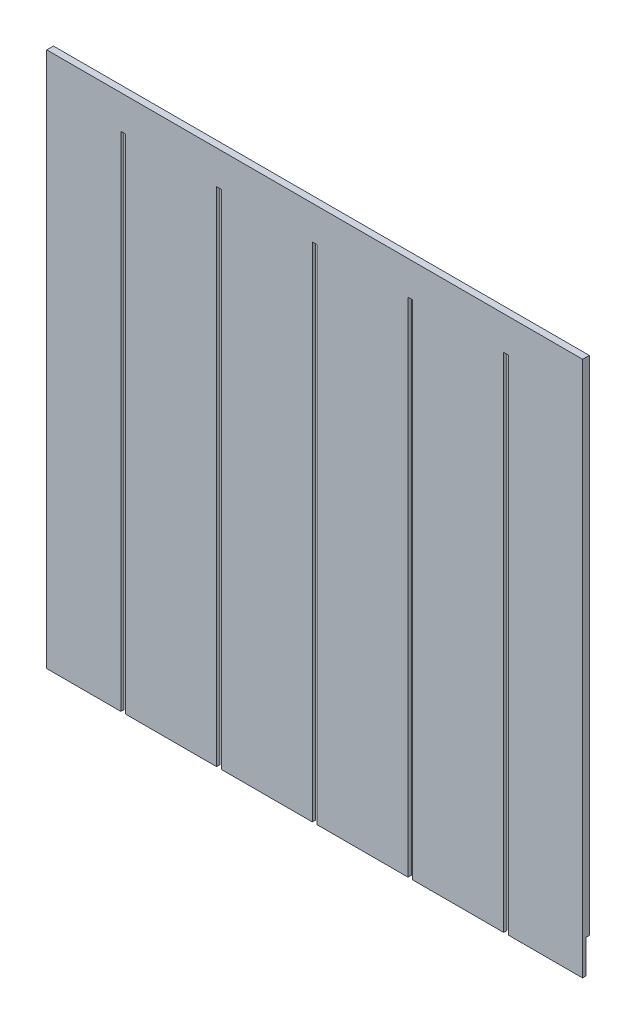
ISO-10303-21;
HEADER;
FILE_DESCRIPTION(('STEP AP214'),'2;1');
FILE_NAME('part.step','',(''),(''),'','','');
FILE_SCHEMA(('AUTOMOTIVE_DESIGN { 1 0 10303 214 1 1 1 1 }'));
ENDSEC;
DATA;
#1=APPLICATION_CONTEXT('core data for automotive mechanical design processes');
#2=APPLICATION_PROTOCOL_DEFINITION('international standard','automotive_design',2000,#1);
#3=PRODUCT_CONTEXT('',#1,'mechanical');
#4=PRODUCT('Part','Part','',(#3));
#5=PRODUCT_RELATED_PRODUCT_CATEGORY('part','',(#4));
#6=PRODUCT_DEFINITION_FORMATION('','',#4);
#7=PRODUCT_DEFINITION_CONTEXT('part definition',#1,'design');
#8=PRODUCT_DEFINITION('design','',#6,#7);
#9=PRODUCT_DEFINITION_SHAPE('','',#8);
#10=(LENGTH_UNIT() NAMED_UNIT(*) SI_UNIT(.MILLI.,.METRE.));
#11=(NAMED_UNIT(*) PLANE_ANGLE_UNIT() SI_UNIT($,.RADIAN.));
#12=(NAMED_UNIT(*) SI_UNIT($,.STERADIAN.) SOLID_ANGLE_UNIT());
#13=UNCERTAINTY_MEASURE_WITH_UNIT(LENGTH_MEASURE(1.E-05),#10,'distance_accuracy_value','');
#14=(GEOMETRIC_REPRESENTATION_CONTEXT(3) GLOBAL_UNCERTAINTY_ASSIGNED_CONTEXT((#13)) GLOBAL_UNIT_ASSIGNED_CONTEXT((#10,
#11,#12)) REPRESENTATION_CONTEXT('',''));
#15=CARTESIAN_POINT('',(0.,0.,0.));
#16=DIRECTION('',(0.,0.,1.));
#17=DIRECTION('',(1.,0.,0.));
#18=AXIS2_PLACEMENT_3D('',#15,#16,#17);
#19=CARTESIAN_POINT('',(0.,0.,0.));
#20=DIRECTION('',(0.,0.,1.));
#21=DIRECTION('',(1.,0.,0.));
#22=AXIS2_PLACEMENT_3D('',#19,#20,#21);
#23=PLANE('',#22);
#24=DIRECTION('',(-1.,0.,0.));
#25=VECTOR('',#24,1.);
#26=CARTESIAN_POINT('',(70.,70.,0.));
#27=LINE('',#26,#25);
#28=CARTESIAN_POINT('',(56.46,70.,0.));
#29=VERTEX_POINT('',#28);
#30=CARTESIAN_POINT('',(29.28,70.,0.));
#31=VERTEX_POINT('',#30);
#32=EDGE_CURVE('E11',#29,#31,#27,.T.);
#33=ORIENTED_EDGE('',*,*,#32,.F.);
#34=DIRECTION('',(0.,-1.,0.));
#35=VECTOR('',#34,1.);
#36=CARTESIAN_POINT('',(56.46,0.,0.));
#37=LINE('',#36,#35);
#38=CARTESIAN_POINT('',(56.46,-80.,0.));
#39=VERTEX_POINT('',#38);
#40=EDGE_CURVE('E298',#29,#39,#37,.T.);
#41=ORIENTED_EDGE('',*,*,#40,.T.);
#42=DIRECTION('',(-1.,0.,0.));
#43=VECTOR('',#42,1.);
#44=CARTESIAN_POINT('',(0.,-80.,0.));
#45=LINE('',#44,#43);
#46=CARTESIAN_POINT('',(29.28,-80.,0.));
#47=VERTEX_POINT('',#46);
#48=EDGE_CURVE('E311',#39,#47,#45,.T.);
#49=ORIENTED_EDGE('',*,*,#48,.T.);
#50=DIRECTION('',(0.,1.,0.));
#51=VECTOR('',#50,1.);
#52=CARTESIAN_POINT('',(29.28,0.,0.));
#53=LINE('',#52,#51);
#54=EDGE_CURVE('E412',#47,#31,#53,.T.);
#55=ORIENTED_EDGE('',*,*,#54,.T.);
#56=EDGE_LOOP('',(#33,#41,#49,#55));
#57=FACE_BOUND('',#56,.T.);
#58=ADVANCED_FACE('F38',(#57),#23,.F.);
#59=CARTESIAN_POINT('',(27.88,70.,0.));
#60=VERTEX_POINT('',#59);
#61=CARTESIAN_POINT('',(0.699999999999999,70.,0.));
#62=VERTEX_POINT('',#61);
#63=EDGE_CURVE('E47',#60,#62,#27,.T.);
#64=ORIENTED_EDGE('',*,*,#63,.F.);
#65=DIRECTION('',(0.,-1.,0.));
#66=VECTOR('',#65,1.);
#67=CARTESIAN_POINT('',(27.88,0.,0.));
#68=LINE('',#67,#66);
#69=CARTESIAN_POINT('',(27.88,-80.,0.));
#70=VERTEX_POINT('',#69);
#71=EDGE_CURVE('E409',#60,#70,#68,.T.);
#72=ORIENTED_EDGE('',*,*,#71,.T.);
#73=DIRECTION('',(1.,0.,0.));
#74=VECTOR('',#73,1.);
#75=CARTESIAN_POINT('',(0.,-80.,0.));
#76=LINE('',#75,#74);
#77=CARTESIAN_POINT('',(0.699999999999985,-80.,0.));
#78=VERTEX_POINT('',#77);
#79=EDGE_CURVE('E406',#78,#70,#76,.T.);
#80=ORIENTED_EDGE('',*,*,#79,.F.);
#81=DIRECTION('',(0.,1.,0.));
#82=VECTOR('',#81,1.);
#83=CARTESIAN_POINT('',(0.699999999999993,0.,0.));
#84=LINE('',#83,#82);
#85=EDGE_CURVE('E403',#78,#62,#84,.T.);
#86=ORIENTED_EDGE('',*,*,#85,.T.);
#87=EDGE_LOOP('',(#64,#72,#80,#86));
#88=FACE_BOUND('',#87,.T.);
#89=ADVANCED_FACE('F617',(#88),#23,.F.);
#90=CARTESIAN_POINT('',(-0.699999999999999,70.,0.));
#91=VERTEX_POINT('',#90);
#92=CARTESIAN_POINT('',(-27.88,70.,0.));
#93=VERTEX_POINT('',#92);
#94=EDGE_CURVE('E477',#91,#93,#27,.T.);
#95=ORIENTED_EDGE('',*,*,#94,.F.);
#96=DIRECTION('',(0.,-1.,0.));
#97=VECTOR('',#96,1.);
#98=CARTESIAN_POINT('',(-0.699999999999993,0.,0.));
#99=LINE('',#98,#97);
#100=CARTESIAN_POINT('',(-0.699999999999985,-80.,0.));
#101=VERTEX_POINT('',#100);
#102=EDGE_CURVE('E400',#91,#101,#99,.T.);
#103=ORIENTED_EDGE('',*,*,#102,.T.);
#104=DIRECTION('',(1.,0.,0.));
#105=VECTOR('',#104,1.);
#106=CARTESIAN_POINT('',(0.,-80.,0.));
#107=LINE('',#106,#105);
#108=CARTESIAN_POINT('',(-27.88,-80.,0.));
#109=VERTEX_POINT('',#108);
#110=EDGE_CURVE('E397',#109,#101,#107,.T.);
#111=ORIENTED_EDGE('',*,*,#110,.F.);
#112=DIRECTION('',(0.,1.,0.));
#113=VECTOR('',#112,1.);
#114=CARTESIAN_POINT('',(-27.88,0.,0.));
#115=LINE('',#114,#113);
#116=EDGE_CURVE('E394',#109,#93,#115,.T.);
#117=ORIENTED_EDGE('',*,*,#116,.T.);
#118=EDGE_LOOP('',(#95,#103,#111,#117));
#119=FACE_BOUND('',#118,.T.);
#120=ADVANCED_FACE('F623',(#119),#23,.F.);
#121=CARTESIAN_POINT('',(-29.28,70.,0.));
#122=VERTEX_POINT('',#121);
#123=CARTESIAN_POINT('',(-56.46,70.,0.));
#124=VERTEX_POINT('',#123);
#125=EDGE_CURVE('E473',#122,#124,#27,.T.);
#126=ORIENTED_EDGE('',*,*,#125,.F.);
#127=DIRECTION('',(0.,-1.,0.));
#128=VECTOR('',#127,1.);
#129=CARTESIAN_POINT('',(-29.28,0.,0.));
#130=LINE('',#129,#128);
#131=CARTESIAN_POINT('',(-29.28,-80.,0.));
#132=VERTEX_POINT('',#131);
#133=EDGE_CURVE('E391',#122,#132,#130,.T.);
#134=ORIENTED_EDGE('',*,*,#133,.T.);
#135=DIRECTION('',(1.,0.,0.));
#136=VECTOR('',#135,1.);
#137=CARTESIAN_POINT('',(0.,-80.,0.));
#138=LINE('',#137,#136);
#139=CARTESIAN_POINT('',(-56.46,-80.,0.));
#140=VERTEX_POINT('',#139);
#141=EDGE_CURVE('E388',#140,#132,#138,.T.);
#142=ORIENTED_EDGE('',*,*,#141,.F.);
#143=DIRECTION('',(0.,1.,0.));
#144=VECTOR('',#143,1.);
#145=CARTESIAN_POINT('',(-56.46,0.,0.));
#146=LINE('',#145,#144);
#147=EDGE_CURVE('E385',#140,#124,#146,.T.);
#148=ORIENTED_EDGE('',*,*,#147,.T.);
#149=EDGE_LOOP('',(#126,#134,#142,#148));
#150=FACE_BOUND('',#149,.T.);
#151=ADVANCED_FACE('F632',(#150),#23,.F.);
#152=DIRECTION('',(-1.,0.,0.));
#153=VECTOR('',#152,1.);
#154=CARTESIAN_POINT('',(-77.5,70.,0.));
#155=LINE('',#154,#153);
#156=CARTESIAN_POINT('',(-77.5,70.,0.));
#157=VERTEX_POINT('',#156);
#158=CARTESIAN_POINT('',(-80.,70.,0.));
#159=VERTEX_POINT('',#158);
#160=EDGE_CURVE('E56',#157,#159,#155,.T.);
#161=ORIENTED_EDGE('',*,*,#160,.F.);
#162=DIRECTION('',(0.,-1.,0.));
#163=VECTOR('',#162,1.);
#164=CARTESIAN_POINT('',(-77.5,70.,0.));
#165=LINE('',#164,#163);
#166=CARTESIAN_POINT('',(-77.5,72.5,0.));
#167=VERTEX_POINT('',#166);
#168=EDGE_CURVE('E60',#167,#157,#165,.T.);
#169=ORIENTED_EDGE('',*,*,#168,.F.);
#170=DIRECTION('',(-1.,0.,0.));
#171=VECTOR('',#170,1.);
#172=CARTESIAN_POINT('',(-72.5,72.5,0.));
#173=LINE('',#172,#171);
#174=CARTESIAN_POINT('',(-72.5,72.5,0.));
#175=VERTEX_POINT('',#174);
#176=EDGE_CURVE('E485',#175,#167,#173,.T.);
#177=ORIENTED_EDGE('',*,*,#176,.F.);
#178=DIRECTION('',(0.,1.,0.));
#179=VECTOR('',#178,1.);
#180=CARTESIAN_POINT('',(-72.5,70.,0.));
#181=LINE('',#180,#179);
#182=CARTESIAN_POINT('',(-72.5,70.,0.));
#183=VERTEX_POINT('',#182);
#184=EDGE_CURVE('E481',#183,#175,#181,.T.);
#185=ORIENTED_EDGE('',*,*,#184,.F.);
#186=CARTESIAN_POINT('',(-57.86,70.,0.));
#187=VERTEX_POINT('',#186);
#188=EDGE_CURVE('E468',#187,#183,#27,.T.);
#189=ORIENTED_EDGE('',*,*,#188,.F.);
#190=DIRECTION('',(0.,-1.,0.));
#191=VECTOR('',#190,1.);
#192=CARTESIAN_POINT('',(-57.86,0.,0.));
#193=LINE('',#192,#191);
#194=CARTESIAN_POINT('',(-57.86,-80.,0.));
#195=VERTEX_POINT('',#194);
#196=EDGE_CURVE('E382',#187,#195,#193,.T.);
#197=ORIENTED_EDGE('',*,*,#196,.T.);
#198=DIRECTION('',(1.,0.,0.));
#199=VECTOR('',#198,1.);
#200=CARTESIAN_POINT('',(0.,-80.,0.));
#201=LINE('',#200,#199);
#202=CARTESIAN_POINT('',(-80.,-80.,0.));
#203=VERTEX_POINT('',#202);
#204=EDGE_CURVE('E379',#203,#195,#201,.T.);
#205=ORIENTED_EDGE('',*,*,#204,.F.);
#206=DIRECTION('',(0.,1.,0.));
#207=VECTOR('',#206,1.);
#208=CARTESIAN_POINT('',(-80.,0.,0.));
#209=LINE('',#208,#207);
#210=EDGE_CURVE('E377',#203,#159,#209,.T.);
#211=ORIENTED_EDGE('',*,*,#210,.T.);
#212=EDGE_LOOP('',(#161,#169,#177,#185,#189,#197,#205,#211));
#213=FACE_BOUND('',#212,.T.);
#214=ADVANCED_FACE('F628',(#213),#23,.F.);
#215=CARTESIAN_POINT('',(70.,70.,0.));
#216=VERTEX_POINT('',#215);
#217=CARTESIAN_POINT('',(57.86,70.,0.));
#218=VERTEX_POINT('',#217);
#219=EDGE_CURVE('E49',#216,#218,#27,.T.);
#220=ORIENTED_EDGE('',*,*,#219,.F.);
#221=DIRECTION('',(0.,1.,0.));
#222=VECTOR('',#221,1.);
#223=CARTESIAN_POINT('',(70.,-70.,0.));
#224=LINE('',#223,#222);
#225=CARTESIAN_POINT('',(70.,-70.,0.));
#226=VERTEX_POINT('',#225);
#227=EDGE_CURVE('E482',#226,#216,#224,.T.);
#228=ORIENTED_EDGE('',*,*,#227,.F.);
#229=DIRECTION('',(-1.,0.,0.));
#230=VECTOR('',#229,1.);
#231=CARTESIAN_POINT('',(72.5,-70.,0.));
#232=LINE('',#231,#230);
#233=CARTESIAN_POINT('',(72.5,-70.,0.));
#234=VERTEX_POINT('',#233);
#235=EDGE_CURVE('E487',#234,#226,#232,.T.);
#236=ORIENTED_EDGE('',*,*,#235,.F.);
#237=DIRECTION('',(0.,-1.,0.));
#238=VECTOR('',#237,1.);
#239=CARTESIAN_POINT('',(72.5,-70.,0.));
#240=LINE('',#239,#238);
#241=CARTESIAN_POINT('',(72.5,-67.5,0.));
#242=VERTEX_POINT('',#241);
#243=EDGE_CURVE('E492',#242,#234,#240,.T.);
#244=ORIENTED_EDGE('',*,*,#243,.F.);
#245=DIRECTION('',(-1.,0.,0.));
#246=VECTOR('',#245,1.);
#247=CARTESIAN_POINT('',(77.5,-67.5,0.));
#248=LINE('',#247,#246);
#249=CARTESIAN_POINT('',(77.5,-67.5,0.));
#250=VERTEX_POINT('',#249);
#251=EDGE_CURVE('E497',#250,#242,#248,.T.);
#252=ORIENTED_EDGE('',*,*,#251,.F.);
#253=DIRECTION('',(0.,1.,0.));
#254=VECTOR('',#253,1.);
#255=CARTESIAN_POINT('',(77.5,-70.,0.));
#256=LINE('',#255,#254);
#257=CARTESIAN_POINT('',(77.5,-70.,0.));
#258=VERTEX_POINT('',#257);
#259=EDGE_CURVE('E500',#258,#250,#256,.T.);
#260=ORIENTED_EDGE('',*,*,#259,.F.);
#261=DIRECTION('',(-1.,0.,0.));
#262=VECTOR('',#261,1.);
#263=CARTESIAN_POINT('',(80.,-70.,0.));
#264=LINE('',#263,#262);
#265=CARTESIAN_POINT('',(80.,-70.,0.));
#266=VERTEX_POINT('',#265);
#267=EDGE_CURVE('E503',#266,#258,#264,.T.);
#268=ORIENTED_EDGE('',*,*,#267,.F.);
#269=DIRECTION('',(0.,1.,0.));
#270=VECTOR('',#269,1.);
#271=CARTESIAN_POINT('',(80.,0.,0.));
#272=LINE('',#271,#270);
#273=CARTESIAN_POINT('',(80.,-80.,0.));
#274=VERTEX_POINT('',#273);
#275=EDGE_CURVE('E297',#274,#266,#272,.T.);
#276=ORIENTED_EDGE('',*,*,#275,.F.);
#277=DIRECTION('',(-1.,0.,0.));
#278=VECTOR('',#277,1.);
#279=CARTESIAN_POINT('',(0.,-80.0000000000001,0.));
#280=LINE('',#279,#278);
#281=CARTESIAN_POINT('',(57.86,-80.,0.));
#282=VERTEX_POINT('',#281);
#283=EDGE_CURVE('E373',#274,#282,#280,.T.);
#284=ORIENTED_EDGE('',*,*,#283,.T.);
#285=DIRECTION('',(0.,1.,0.));
#286=VECTOR('',#285,1.);
#287=CARTESIAN_POINT('',(57.86,0.,0.));
#288=LINE('',#287,#286);
#289=EDGE_CURVE('E301',#282,#218,#288,.T.);
#290=ORIENTED_EDGE('',*,*,#289,.T.);
#291=EDGE_LOOP('',(#220,#228,#236,#244,#252,#260,#268,#276,#284,#290));
#292=FACE_BOUND('',#291,.T.);
#293=ADVANCED_FACE('F600',(#292),#23,.F.);
#294=CARTESIAN_POINT('',(56.46,0.,1.));
#295=DIRECTION('',(1.,0.,0.));
#296=DIRECTION('',(0.,1.,0.));
#297=AXIS2_PLACEMENT_3D('',#294,#295,#296);
#298=PLANE('',#297);
#299=ORIENTED_EDGE('',*,*,#40,.F.);
#300=DIRECTION('',(0.,0.,-1.));
#301=VECTOR('',#300,1.);
#302=CARTESIAN_POINT('',(56.46,70.,1.));
#303=LINE('',#302,#301);
#304=CARTESIAN_POINT('',(56.46,70.,1.));
#305=VERTEX_POINT('',#304);
#306=EDGE_CURVE('E42',#305,#29,#303,.T.);
#307=ORIENTED_EDGE('',*,*,#306,.F.);
#308=DIRECTION('',(0.,-1.,0.));
#309=VECTOR('',#308,1.);
#310=CARTESIAN_POINT('',(56.46,0.,1.));
#311=LINE('',#310,#309);
#312=CARTESIAN_POINT('',(56.46,-80.,1.));
#313=VERTEX_POINT('',#312);
#314=EDGE_CURVE('E307',#305,#313,#311,.T.);
#315=ORIENTED_EDGE('',*,*,#314,.T.);
#316=DIRECTION('',(0.,0.,-1.));
#317=VECTOR('',#316,1.);
#318=CARTESIAN_POINT('',(56.46,-80.,1.));
#319=LINE('',#318,#317);
#320=EDGE_CURVE('E369',#313,#39,#319,.T.);
#321=ORIENTED_EDGE('',*,*,#320,.T.);
#322=EDGE_LOOP('',(#299,#307,#315,#321));
#323=FACE_BOUND('',#322,.T.);
#324=ADVANCED_FACE('F40',(#323),#298,.T.);
#325=CARTESIAN_POINT('',(57.86,0.,1.));
#326=DIRECTION('',(-1.,0.,0.));
#327=DIRECTION('',(0.,-1.,0.));
#328=AXIS2_PLACEMENT_3D('',#325,#326,#327);
#329=PLANE('',#328);
#330=ORIENTED_EDGE('',*,*,#289,.F.);
#331=DIRECTION('',(0.,0.,-1.));
#332=VECTOR('',#331,1.);
#333=CARTESIAN_POINT('',(57.86,-80.,1.));
#334=LINE('',#333,#332);
#335=CARTESIAN_POINT('',(57.86,-80.,1.));
#336=VERTEX_POINT('',#335);
#337=EDGE_CURVE('E462',#336,#282,#334,.T.);
#338=ORIENTED_EDGE('',*,*,#337,.F.);
#339=DIRECTION('',(0.,1.,0.));
#340=VECTOR('',#339,1.);
#341=CARTESIAN_POINT('',(57.86,0.,1.));
#342=LINE('',#341,#340);
#343=CARTESIAN_POINT('',(57.86,70.,1.));
#344=VERTEX_POINT('',#343);
#345=EDGE_CURVE('E313',#336,#344,#342,.T.);
#346=ORIENTED_EDGE('',*,*,#345,.T.);
#347=DIRECTION('',(0.,0.,-1.));
#348=VECTOR('',#347,1.);
#349=CARTESIAN_POINT('',(57.86,70.,1.));
#350=LINE('',#349,#348);
#351=EDGE_CURVE('E463',#344,#218,#350,.T.);
#352=ORIENTED_EDGE('',*,*,#351,.T.);
#353=EDGE_LOOP('',(#330,#338,#346,#352));
#354=FACE_BOUND('',#353,.T.);
#355=ADVANCED_FACE('F602',(#354),#329,.T.);
#356=CARTESIAN_POINT('',(0.,-80.0000000000001,1.));
#357=DIRECTION('',(0.,-1.,0.));
#358=DIRECTION('',(1.,0.,0.));
#359=AXIS2_PLACEMENT_3D('',#356,#357,#358);
#360=PLANE('',#359);
#361=ORIENTED_EDGE('',*,*,#283,.F.);
#362=DIRECTION('',(0.,0.,-1.));
#363=VECTOR('',#362,1.);
#364=CARTESIAN_POINT('',(80.,-80.,1.));
#365=LINE('',#364,#363);
#366=CARTESIAN_POINT('',(80.,-80.,1.));
#367=VERTEX_POINT('',#366);
#368=EDGE_CURVE('E460',#367,#274,#365,.T.);
#369=ORIENTED_EDGE('',*,*,#368,.F.);
#370=DIRECTION('',(-1.,0.,0.));
#371=VECTOR('',#370,1.);
#372=CARTESIAN_POINT('',(0.,-80.0000000000001,1.));
#373=LINE('',#372,#371);
#374=EDGE_CURVE('E316',#367,#336,#373,.T.);
#375=ORIENTED_EDGE('',*,*,#374,.T.);
#376=ORIENTED_EDGE('',*,*,#337,.T.);
#377=EDGE_LOOP('',(#361,#369,#375,#376));
#378=FACE_BOUND('',#377,.T.);
#379=ADVANCED_FACE('F601',(#378),#360,.T.);
#380=CARTESIAN_POINT('',(80.,0.,1.));
#381=DIRECTION('',(-1.,0.,0.));
#382=DIRECTION('',(0.,0.,1.));
#383=AXIS2_PLACEMENT_3D('',#380,#381,#382);
#384=PLANE('',#383);
#385=ORIENTED_EDGE('',*,*,#275,.T.);
#386=DIRECTION('',(0.,0.,1.));
#387=VECTOR('',#386,1.);
#388=CARTESIAN_POINT('',(80.,-70.,-1.));
#389=LINE('',#388,#387);
#390=CARTESIAN_POINT('',(80.,-70.,-1.));
#391=VERTEX_POINT('',#390);
#392=EDGE_CURVE('E277',#391,#266,#389,.T.);
#393=ORIENTED_EDGE('',*,*,#392,.F.);
#394=DIRECTION('',(0.,-1.,0.));
#395=VECTOR('',#394,1.);
#396=CARTESIAN_POINT('',(80.,80.,-1.));
#397=LINE('',#396,#395);
#398=CARTESIAN_POINT('',(80.,80.,-1.));
#399=VERTEX_POINT('',#398);
#400=EDGE_CURVE('E283',#399,#391,#397,.T.);
#401=ORIENTED_EDGE('',*,*,#400,.F.);
#402=DIRECTION('',(0.,0.,-1.));
#403=VECTOR('',#402,1.);
#404=CARTESIAN_POINT('',(80.,80.,1.));
#405=LINE('',#404,#403);
#406=CARTESIAN_POINT('',(80.,80.,1.));
#407=VERTEX_POINT('',#406);
#408=EDGE_CURVE('E458',#407,#399,#405,.T.);
#409=ORIENTED_EDGE('',*,*,#408,.F.);
#410=DIRECTION('',(0.,1.,0.));
#411=VECTOR('',#410,1.);
#412=CARTESIAN_POINT('',(80.,0.,1.));
#413=LINE('',#412,#411);
#414=EDGE_CURVE('E319',#367,#407,#413,.T.);
#415=ORIENTED_EDGE('',*,*,#414,.F.);
#416=ORIENTED_EDGE('',*,*,#368,.T.);
#417=EDGE_LOOP('',(#385,#393,#401,#409,#415,#416));
#418=FACE_BOUND('',#417,.T.);
#419=ADVANCED_FACE('F295',(#418),#384,.F.);
#420=CARTESIAN_POINT('',(0.,80.,1.));
#421=DIRECTION('',(0.,1.,0.));
#422=DIRECTION('',(0.,0.,1.));
#423=AXIS2_PLACEMENT_3D('',#420,#421,#422);
#424=PLANE('',#423);
#425=ORIENTED_EDGE('',*,*,#408,.T.);
#426=DIRECTION('',(1.,0.,0.));
#427=VECTOR('',#426,1.);
#428=CARTESIAN_POINT('',(-80.,80.,-1.));
#429=LINE('',#428,#427);
#430=CARTESIAN_POINT('',(-80.,80.,-1.));
#431=VERTEX_POINT('',#430);
#432=EDGE_CURVE('E290',#431,#399,#429,.T.);
#433=ORIENTED_EDGE('',*,*,#432,.F.);
#434=DIRECTION('',(0.,0.,-1.));
#435=VECTOR('',#434,1.);
#436=CARTESIAN_POINT('',(-80.,80.,1.));
#437=LINE('',#436,#435);
#438=CARTESIAN_POINT('',(-80.,80.,1.));
#439=VERTEX_POINT('',#438);
#440=EDGE_CURVE('E456',#439,#431,#437,.T.);
#441=ORIENTED_EDGE('',*,*,#440,.F.);
#442=DIRECTION('',(1.,0.,0.));
#443=VECTOR('',#442,1.);
#444=CARTESIAN_POINT('',(0.,80.,1.));
#445=LINE('',#444,#443);
#446=EDGE_CURVE('E321',#439,#407,#445,.T.);
#447=ORIENTED_EDGE('',*,*,#446,.T.);
#448=EDGE_LOOP('',(#425,#433,#441,#447));
#449=FACE_BOUND('',#448,.T.);
#450=ADVANCED_FACE('F590',(#449),#424,.T.);
#451=CARTESIAN_POINT('',(-80.,0.,1.));
#452=DIRECTION('',(-1.,0.,0.));
#453=DIRECTION('',(0.,0.,1.));
#454=AXIS2_PLACEMENT_3D('',#451,#452,#453);
#455=PLANE('',#454);
#456=ORIENTED_EDGE('',*,*,#210,.F.);
#457=DIRECTION('',(0.,0.,-1.));
#458=VECTOR('',#457,1.);
#459=CARTESIAN_POINT('',(-80.,-80.,1.));
#460=LINE('',#459,#458);
#461=CARTESIAN_POINT('',(-80.,-80.,1.));
#462=VERTEX_POINT('',#461);
#463=EDGE_CURVE('E454',#462,#203,#460,.T.);
#464=ORIENTED_EDGE('',*,*,#463,.F.);
#465=DIRECTION('',(0.,1.,0.));
#466=VECTOR('',#465,1.);
#467=CARTESIAN_POINT('',(-80.,0.,1.));
#468=LINE('',#467,#466);
#469=EDGE_CURVE('E324',#462,#439,#468,.T.);
#470=ORIENTED_EDGE('',*,*,#469,.T.);
#471=ORIENTED_EDGE('',*,*,#440,.T.);
#472=DIRECTION('',(0.,1.,0.));
#473=VECTOR('',#472,1.);
#474=CARTESIAN_POINT('',(-80.,70.,-1.));
#475=LINE('',#474,#473);
#476=CARTESIAN_POINT('',(-80.,70.,-1.));
#477=VERTEX_POINT('',#476);
#478=EDGE_CURVE('E507',#477,#431,#475,.T.);
#479=ORIENTED_EDGE('',*,*,#478,.F.);
#480=DIRECTION('',(0.,0.,1.));
#481=VECTOR('',#480,1.);
#482=CARTESIAN_POINT('',(-80.,70.,-1.));
#483=LINE('',#482,#481);
#484=EDGE_CURVE('E506',#477,#159,#483,.T.);
#485=ORIENTED_EDGE('',*,*,#484,.T.);
#486=EDGE_LOOP('',(#456,#464,#470,#471,#479,#485));
#487=FACE_BOUND('',#486,.T.);
#488=ADVANCED_FACE('F586',(#487),#455,.T.);
#489=CARTESIAN_POINT('',(0.,-80.,1.));
#490=DIRECTION('',(0.,1.,0.));
#491=DIRECTION('',(0.,0.,1.));
#492=AXIS2_PLACEMENT_3D('',#489,#490,#491);
#493=PLANE('',#492);
#494=ORIENTED_EDGE('',*,*,#204,.T.);
#495=DIRECTION('',(0.,0.,-1.));
#496=VECTOR('',#495,1.);
#497=CARTESIAN_POINT('',(-57.86,-80.,1.));
#498=LINE('',#497,#496);
#499=CARTESIAN_POINT('',(-57.86,-80.,1.));
#500=VERTEX_POINT('',#499);
#501=EDGE_CURVE('E452',#500,#195,#498,.T.);
#502=ORIENTED_EDGE('',*,*,#501,.F.);
#503=DIRECTION('',(1.,0.,0.));
#504=VECTOR('',#503,1.);
#505=CARTESIAN_POINT('',(0.,-80.,1.));
#506=LINE('',#505,#504);
#507=EDGE_CURVE('E327',#462,#500,#506,.T.);
#508=ORIENTED_EDGE('',*,*,#507,.F.);
#509=ORIENTED_EDGE('',*,*,#463,.T.);
#510=EDGE_LOOP('',(#494,#502,#508,#509));
#511=FACE_BOUND('',#510,.T.);
#512=ADVANCED_FACE('F666',(#511),#493,.F.);
#513=CARTESIAN_POINT('',(-57.86,0.,1.));
#514=DIRECTION('',(1.,0.,0.));
#515=DIRECTION('',(0.,1.,0.));
#516=AXIS2_PLACEMENT_3D('',#513,#514,#515);
#517=PLANE('',#516);
#518=ORIENTED_EDGE('',*,*,#196,.F.);
#519=DIRECTION('',(0.,0.,-1.));
#520=VECTOR('',#519,1.);
#521=CARTESIAN_POINT('',(-57.86,70.,1.));
#522=LINE('',#521,#520);
#523=CARTESIAN_POINT('',(-57.86,70.,1.));
#524=VERTEX_POINT('',#523);
#525=EDGE_CURVE('E449',#524,#187,#522,.T.);
#526=ORIENTED_EDGE('',*,*,#525,.F.);
#527=DIRECTION('',(0.,-1.,0.));
#528=VECTOR('',#527,1.);
#529=CARTESIAN_POINT('',(-57.86,0.,1.));
#530=LINE('',#529,#528);
#531=EDGE_CURVE('E329',#524,#500,#530,.T.);
#532=ORIENTED_EDGE('',*,*,#531,.T.);
#533=ORIENTED_EDGE('',*,*,#501,.T.);
#534=EDGE_LOOP('',(#518,#526,#532,#533));
#535=FACE_BOUND('',#534,.T.);
#536=ADVANCED_FACE('F663',(#535),#517,.T.);
#537=CARTESIAN_POINT('',(-56.46,0.,1.));
#538=DIRECTION('',(-1.,0.,0.));
#539=DIRECTION('',(0.,-1.,0.));
#540=AXIS2_PLACEMENT_3D('',#537,#538,#539);
#541=PLANE('',#540);
#542=ORIENTED_EDGE('',*,*,#147,.F.);
#543=DIRECTION('',(0.,0.,-1.));
#544=VECTOR('',#543,1.);
#545=CARTESIAN_POINT('',(-56.46,-80.,1.));
#546=LINE('',#545,#544);
#547=CARTESIAN_POINT('',(-56.46,-80.,1.));
#548=VERTEX_POINT('',#547);
#549=EDGE_CURVE('E445',#548,#140,#546,.T.);
#550=ORIENTED_EDGE('',*,*,#549,.F.);
#551=DIRECTION('',(0.,1.,0.));
#552=VECTOR('',#551,1.);
#553=CARTESIAN_POINT('',(-56.46,0.,1.));
#554=LINE('',#553,#552);
#555=CARTESIAN_POINT('',(-56.46,70.,1.));
#556=VERTEX_POINT('',#555);
#557=EDGE_CURVE('E334',#548,#556,#554,.T.);
#558=ORIENTED_EDGE('',*,*,#557,.T.);
#559=DIRECTION('',(0.,0.,-1.));
#560=VECTOR('',#559,1.);
#561=CARTESIAN_POINT('',(-56.46,70.,1.));
#562=LINE('',#561,#560);
#563=EDGE_CURVE('E447',#556,#124,#562,.T.);
#564=ORIENTED_EDGE('',*,*,#563,.T.);
#565=EDGE_LOOP('',(#542,#550,#558,#564));
#566=FACE_BOUND('',#565,.T.);
#567=ADVANCED_FACE('F655',(#566),#541,.T.);
#568=CARTESIAN_POINT('',(0.,-80.,1.));
#569=DIRECTION('',(0.,1.,0.));
#570=DIRECTION('',(0.,0.,1.));
#571=AXIS2_PLACEMENT_3D('',#568,#569,#570);
#572=PLANE('',#571);
#573=ORIENTED_EDGE('',*,*,#141,.T.);
#574=DIRECTION('',(0.,0.,-1.));
#575=VECTOR('',#574,1.);
#576=CARTESIAN_POINT('',(-29.28,-80.,1.));
#577=LINE('',#576,#575);
#578=CARTESIAN_POINT('',(-29.28,-80.,1.));
#579=VERTEX_POINT('',#578);
#580=EDGE_CURVE('E443',#579,#132,#577,.T.);
#581=ORIENTED_EDGE('',*,*,#580,.F.);
#582=DIRECTION('',(1.,0.,0.));
#583=VECTOR('',#582,1.);
#584=CARTESIAN_POINT('',(0.,-80.,1.));
#585=LINE('',#584,#583);
#586=EDGE_CURVE('E337',#548,#579,#585,.T.);
#587=ORIENTED_EDGE('',*,*,#586,.F.);
#588=ORIENTED_EDGE('',*,*,#549,.T.);
#589=EDGE_LOOP('',(#573,#581,#587,#588));
#590=FACE_BOUND('',#589,.T.);
#591=ADVANCED_FACE('F653',(#590),#572,.F.);
#592=CARTESIAN_POINT('',(-29.28,0.,1.));
#593=DIRECTION('',(1.,0.,0.));
#594=DIRECTION('',(0.,1.,0.));
#595=AXIS2_PLACEMENT_3D('',#592,#593,#594);
#596=PLANE('',#595);
#597=ORIENTED_EDGE('',*,*,#133,.F.);
#598=DIRECTION('',(0.,0.,-1.));
#599=VECTOR('',#598,1.);
#600=CARTESIAN_POINT('',(-29.28,70.,1.));
#601=LINE('',#600,#599);
#602=CARTESIAN_POINT('',(-29.28,70.,1.));
#603=VERTEX_POINT('',#602);
#604=EDGE_CURVE('E440',#603,#122,#601,.T.);
#605=ORIENTED_EDGE('',*,*,#604,.F.);
#606=DIRECTION('',(0.,-1.,0.));
#607=VECTOR('',#606,1.);
#608=CARTESIAN_POINT('',(-29.28,0.,1.));
#609=LINE('',#608,#607);
#610=EDGE_CURVE('E339',#603,#579,#609,.T.);
#611=ORIENTED_EDGE('',*,*,#610,.T.);
#612=ORIENTED_EDGE('',*,*,#580,.T.);
#613=EDGE_LOOP('',(#597,#605,#611,#612));
#614=FACE_BOUND('',#613,.T.);
#615=ADVANCED_FACE('F649',(#614),#596,.T.);
#616=CARTESIAN_POINT('',(-27.88,0.,1.));
#617=DIRECTION('',(-1.,0.,0.));
#618=DIRECTION('',(0.,-1.,0.));
#619=AXIS2_PLACEMENT_3D('',#616,#617,#618);
#620=PLANE('',#619);
#621=ORIENTED_EDGE('',*,*,#116,.F.);
#622=DIRECTION('',(0.,0.,-1.));
#623=VECTOR('',#622,1.);
#624=CARTESIAN_POINT('',(-27.88,-80.,1.));
#625=LINE('',#624,#623);
#626=CARTESIAN_POINT('',(-27.88,-80.,1.));
#627=VERTEX_POINT('',#626);
#628=EDGE_CURVE('E436',#627,#109,#625,.T.);
#629=ORIENTED_EDGE('',*,*,#628,.F.);
#630=DIRECTION('',(0.,1.,0.));
#631=VECTOR('',#630,1.);
#632=CARTESIAN_POINT('',(-27.88,0.,1.));
#633=LINE('',#632,#631);
#634=CARTESIAN_POINT('',(-27.88,70.,1.));
#635=VERTEX_POINT('',#634);
#636=EDGE_CURVE('E344',#627,#635,#633,.T.);
#637=ORIENTED_EDGE('',*,*,#636,.T.);
#638=DIRECTION('',(0.,0.,-1.));
#639=VECTOR('',#638,1.);
#640=CARTESIAN_POINT('',(-27.88,70.,1.));
#641=LINE('',#640,#639);
#642=EDGE_CURVE('E438',#635,#93,#641,.T.);
#643=ORIENTED_EDGE('',*,*,#642,.T.);
#644=EDGE_LOOP('',(#621,#629,#637,#643));
#645=FACE_BOUND('',#644,.T.);
#646=ADVANCED_FACE('F720',(#645),#620,.T.);
#647=CARTESIAN_POINT('',(0.,-80.,1.));
#648=DIRECTION('',(0.,1.,0.));
#649=DIRECTION('',(0.,0.,1.));
#650=AXIS2_PLACEMENT_3D('',#647,#648,#649);
#651=PLANE('',#650);
#652=ORIENTED_EDGE('',*,*,#110,.T.);
#653=DIRECTION('',(0.,0.,-1.));
#654=VECTOR('',#653,1.);
#655=CARTESIAN_POINT('',(-0.699999999999985,-80.,1.));
#656=LINE('',#655,#654);
#657=CARTESIAN_POINT('',(-0.699999999999985,-80.,1.));
#658=VERTEX_POINT('',#657);
#659=EDGE_CURVE('E434',#658,#101,#656,.T.);
#660=ORIENTED_EDGE('',*,*,#659,.F.);
#661=DIRECTION('',(1.,0.,0.));
#662=VECTOR('',#661,1.);
#663=CARTESIAN_POINT('',(0.,-80.,1.));
#664=LINE('',#663,#662);
#665=EDGE_CURVE('E347',#627,#658,#664,.T.);
#666=ORIENTED_EDGE('',*,*,#665,.F.);
#667=ORIENTED_EDGE('',*,*,#628,.T.);
#668=EDGE_LOOP('',(#652,#660,#666,#667));
#669=FACE_BOUND('',#668,.T.);
#670=ADVANCED_FACE('F730',(#669),#651,.F.);
#671=CARTESIAN_POINT('',(-0.699999999999993,0.,1.));
#672=DIRECTION('',(1.,0.,0.));
#673=DIRECTION('',(0.,1.,0.));
#674=AXIS2_PLACEMENT_3D('',#671,#672,#673);
#675=PLANE('',#674);
#676=ORIENTED_EDGE('',*,*,#102,.F.);
#677=DIRECTION('',(0.,0.,-1.));
#678=VECTOR('',#677,1.);
#679=CARTESIAN_POINT('',(-0.699999999999999,70.,1.));
#680=LINE('',#679,#678);
#681=CARTESIAN_POINT('',(-0.699999999999999,70.,1.));
#682=VERTEX_POINT('',#681);
#683=EDGE_CURVE('E431',#682,#91,#680,.T.);
#684=ORIENTED_EDGE('',*,*,#683,.F.);
#685=DIRECTION('',(0.,-1.,0.));
#686=VECTOR('',#685,1.);
#687=CARTESIAN_POINT('',(-0.699999999999993,0.,1.));
#688=LINE('',#687,#686);
#689=EDGE_CURVE('E349',#682,#658,#688,.T.);
#690=ORIENTED_EDGE('',*,*,#689,.T.);
#691=ORIENTED_EDGE('',*,*,#659,.T.);
#692=EDGE_LOOP('',(#676,#684,#690,#691));
#693=FACE_BOUND('',#692,.T.);
#694=ADVANCED_FACE('F738',(#693),#675,.T.);
#695=CARTESIAN_POINT('',(0.699999999999993,0.,1.));
#696=DIRECTION('',(-1.,0.,0.));
#697=DIRECTION('',(0.,-1.,0.));
#698=AXIS2_PLACEMENT_3D('',#695,#696,#697);
#699=PLANE('',#698);
#700=ORIENTED_EDGE('',*,*,#85,.F.);
#701=DIRECTION('',(0.,0.,-1.));
#702=VECTOR('',#701,1.);
#703=CARTESIAN_POINT('',(0.699999999999985,-80.,1.));
#704=LINE('',#703,#702);
#705=CARTESIAN_POINT('',(0.699999999999985,-80.,1.));
#706=VERTEX_POINT('',#705);
#707=EDGE_CURVE('E427',#706,#78,#704,.T.);
#708=ORIENTED_EDGE('',*,*,#707,.F.);
#709=DIRECTION('',(0.,1.,0.));
#710=VECTOR('',#709,1.);
#711=CARTESIAN_POINT('',(0.699999999999993,0.,1.));
#712=LINE('',#711,#710);
#713=CARTESIAN_POINT('',(0.699999999999999,70.,1.));
#714=VERTEX_POINT('',#713);
#715=EDGE_CURVE('E354',#706,#714,#712,.T.);
#716=ORIENTED_EDGE('',*,*,#715,.T.);
#717=DIRECTION('',(0.,0.,-1.));
#718=VECTOR('',#717,1.);
#719=CARTESIAN_POINT('',(0.699999999999999,70.,1.));
#720=LINE('',#719,#718);
#721=EDGE_CURVE('E429',#714,#62,#720,.T.);
#722=ORIENTED_EDGE('',*,*,#721,.T.);
#723=EDGE_LOOP('',(#700,#708,#716,#722));
#724=FACE_BOUND('',#723,.T.);
#725=ADVANCED_FACE('F743',(#724),#699,.T.);
#726=CARTESIAN_POINT('',(0.,-80.,1.));
#727=DIRECTION('',(0.,1.,0.));
#728=DIRECTION('',(0.,0.,1.));
#729=AXIS2_PLACEMENT_3D('',#726,#727,#728);
#730=PLANE('',#729);
#731=ORIENTED_EDGE('',*,*,#79,.T.);
#732=DIRECTION('',(0.,0.,-1.));
#733=VECTOR('',#732,1.);
#734=CARTESIAN_POINT('',(27.88,-80.,1.));
#735=LINE('',#734,#733);
#736=CARTESIAN_POINT('',(27.88,-80.,1.));
#737=VERTEX_POINT('',#736);
#738=EDGE_CURVE('E425',#737,#70,#735,.T.);
#739=ORIENTED_EDGE('',*,*,#738,.F.);
#740=DIRECTION('',(1.,0.,0.));
#741=VECTOR('',#740,1.);
#742=CARTESIAN_POINT('',(0.,-80.,1.));
#743=LINE('',#742,#741);
#744=EDGE_CURVE('E357',#706,#737,#743,.T.);
#745=ORIENTED_EDGE('',*,*,#744,.F.);
#746=ORIENTED_EDGE('',*,*,#707,.T.);
#747=EDGE_LOOP('',(#731,#739,#745,#746));
#748=FACE_BOUND('',#747,.T.);
#749=ADVANCED_FACE('F755',(#748),#730,.F.);
#750=CARTESIAN_POINT('',(27.88,0.,1.));
#751=DIRECTION('',(1.,0.,0.));
#752=DIRECTION('',(0.,1.,0.));
#753=AXIS2_PLACEMENT_3D('',#750,#751,#752);
#754=PLANE('',#753);
#755=ORIENTED_EDGE('',*,*,#71,.F.);
#756=DIRECTION('',(0.,0.,-1.));
#757=VECTOR('',#756,1.);
#758=CARTESIAN_POINT('',(27.88,70.,1.));
#759=LINE('',#758,#757);
#760=CARTESIAN_POINT('',(27.88,70.,1.));
#761=VERTEX_POINT('',#760);
#762=EDGE_CURVE('E422',#761,#60,#759,.T.);
#763=ORIENTED_EDGE('',*,*,#762,.F.);
#764=DIRECTION('',(0.,-1.,0.));
#765=VECTOR('',#764,1.);
#766=CARTESIAN_POINT('',(27.88,0.,1.));
#767=LINE('',#766,#765);
#768=EDGE_CURVE('E359',#761,#737,#767,.T.);
#769=ORIENTED_EDGE('',*,*,#768,.T.);
#770=ORIENTED_EDGE('',*,*,#738,.T.);
#771=EDGE_LOOP('',(#755,#763,#769,#770));
#772=FACE_BOUND('',#771,.T.);
#773=ADVANCED_FACE('F763',(#772),#754,.T.);
#774=CARTESIAN_POINT('',(0.,70.,1.));
#775=DIRECTION('',(0.,1.,0.));
#776=DIRECTION('',(0.,0.,1.));
#777=AXIS2_PLACEMENT_3D('',#774,#775,#776);
#778=PLANE('',#777);
#779=ORIENTED_EDGE('',*,*,#762,.T.);
#780=ORIENTED_EDGE('',*,*,#63,.T.);
#781=ORIENTED_EDGE('',*,*,#721,.F.);
#782=DIRECTION('',(1.,0.,0.));
#783=VECTOR('',#782,1.);
#784=CARTESIAN_POINT('',(0.,70.,1.));
#785=LINE('',#784,#783);
#786=EDGE_CURVE('E352',#682,#714,#785,.T.);
#787=ORIENTED_EDGE('',*,*,#786,.F.);
#788=ORIENTED_EDGE('',*,*,#683,.T.);
#789=ORIENTED_EDGE('',*,*,#94,.T.);
#790=ORIENTED_EDGE('',*,*,#642,.F.);
#791=DIRECTION('',(1.,0.,0.));
#792=VECTOR('',#791,1.);
#793=CARTESIAN_POINT('',(0.,70.,1.));
#794=LINE('',#793,#792);
#795=EDGE_CURVE('E342',#603,#635,#794,.T.);
#796=ORIENTED_EDGE('',*,*,#795,.F.);
#797=ORIENTED_EDGE('',*,*,#604,.T.);
#798=ORIENTED_EDGE('',*,*,#125,.T.);
#799=ORIENTED_EDGE('',*,*,#563,.F.);
#800=DIRECTION('',(1.,0.,0.));
#801=VECTOR('',#800,1.);
#802=CARTESIAN_POINT('',(0.,70.,1.));
#803=LINE('',#802,#801);
#804=EDGE_CURVE('E332',#524,#556,#803,.T.);
#805=ORIENTED_EDGE('',*,*,#804,.F.);
#806=ORIENTED_EDGE('',*,*,#525,.T.);
#807=ORIENTED_EDGE('',*,*,#188,.T.);
#808=DIRECTION('',(0.,0.,1.));
#809=VECTOR('',#808,1.);
#810=CARTESIAN_POINT('',(-72.5,70.,-1.));
#811=LINE('',#810,#809);
#812=CARTESIAN_POINT('',(-72.5,70.,-1.));
#813=VERTEX_POINT('',#812);
#814=EDGE_CURVE('E554',#813,#183,#811,.T.);
#815=ORIENTED_EDGE('',*,*,#814,.F.);
#816=DIRECTION('',(-1.,0.,0.));
#817=VECTOR('',#816,1.);
#818=CARTESIAN_POINT('',(70.,70.,-1.));
#819=LINE('',#818,#817);
#820=CARTESIAN_POINT('',(70.,70.,-1.));
#821=VERTEX_POINT('',#820);
#822=EDGE_CURVE('E517',#821,#813,#819,.T.);
#823=ORIENTED_EDGE('',*,*,#822,.F.);
#824=DIRECTION('',(0.,0.,1.));
#825=VECTOR('',#824,1.);
#826=CARTESIAN_POINT('',(70.,70.,-1.));
#827=LINE('',#826,#825);
#828=EDGE_CURVE('E550',#821,#216,#827,.T.);
#829=ORIENTED_EDGE('',*,*,#828,.T.);
#830=ORIENTED_EDGE('',*,*,#219,.T.);
#831=ORIENTED_EDGE('',*,*,#351,.F.);
#832=DIRECTION('',(1.,0.,0.));
#833=VECTOR('',#832,1.);
#834=CARTESIAN_POINT('',(0.,70.,1.));
#835=LINE('',#834,#833);
#836=EDGE_CURVE('E310',#305,#344,#835,.T.);
#837=ORIENTED_EDGE('',*,*,#836,.F.);
#838=ORIENTED_EDGE('',*,*,#306,.T.);
#839=ORIENTED_EDGE('',*,*,#32,.T.);
#840=DIRECTION('',(0.,0.,-1.));
#841=VECTOR('',#840,1.);
#842=CARTESIAN_POINT('',(29.28,70.,1.));
#843=LINE('',#842,#841);
#844=CARTESIAN_POINT('',(29.28,70.,1.));
#845=VERTEX_POINT('',#844);
#846=EDGE_CURVE('E420',#845,#31,#843,.T.);
#847=ORIENTED_EDGE('',*,*,#846,.F.);
#848=DIRECTION('',(1.,0.,0.));
#849=VECTOR('',#848,1.);
#850=CARTESIAN_POINT('',(0.,70.,1.));
#851=LINE('',#850,#849);
#852=EDGE_CURVE('E362',#761,#845,#851,.T.);
#853=ORIENTED_EDGE('',*,*,#852,.F.);
#854=EDGE_LOOP('',(#779,#780,#781,#787,#788,#789,#790,#796,#797,#798,#799,#805,#806,#807,#815,
#823,#829,#830,#831,#837,#838,#839,#847,#853));
#855=FACE_BOUND('',#854,.T.);
#856=ADVANCED_FACE('F556',(#855),#778,.F.);
#857=CARTESIAN_POINT('',(29.28,0.,1.));
#858=DIRECTION('',(-1.,0.,0.));
#859=DIRECTION('',(0.,-1.,0.));
#860=AXIS2_PLACEMENT_3D('',#857,#858,#859);
#861=PLANE('',#860);
#862=ORIENTED_EDGE('',*,*,#54,.F.);
#863=DIRECTION('',(0.,0.,-1.));
#864=VECTOR('',#863,1.);
#865=CARTESIAN_POINT('',(29.28,-80.,1.));
#866=LINE('',#865,#864);
#867=CARTESIAN_POINT('',(29.28,-80.,1.));
#868=VERTEX_POINT('',#867);
#869=EDGE_CURVE('E418',#868,#47,#866,.T.);
#870=ORIENTED_EDGE('',*,*,#869,.F.);
#871=DIRECTION('',(0.,1.,0.));
#872=VECTOR('',#871,1.);
#873=CARTESIAN_POINT('',(29.28,0.,1.));
#874=LINE('',#873,#872);
#875=EDGE_CURVE('E364',#868,#845,#874,.T.);
#876=ORIENTED_EDGE('',*,*,#875,.T.);
#877=ORIENTED_EDGE('',*,*,#846,.T.);
#878=EDGE_LOOP('',(#862,#870,#876,#877));
#879=FACE_BOUND('',#878,.T.);
#880=ADVANCED_FACE('F778',(#879),#861,.T.);
#881=CARTESIAN_POINT('',(0.,-80.,1.));
#882=DIRECTION('',(0.,-1.,0.));
#883=DIRECTION('',(0.,0.,-1.));
#884=AXIS2_PLACEMENT_3D('',#881,#882,#883);
#885=PLANE('',#884);
#886=ORIENTED_EDGE('',*,*,#48,.F.);
#887=ORIENTED_EDGE('',*,*,#320,.F.);
#888=DIRECTION('',(-1.,0.,0.));
#889=VECTOR('',#888,1.);
#890=CARTESIAN_POINT('',(0.,-80.,1.));
#891=LINE('',#890,#889);
#892=EDGE_CURVE('E367',#313,#868,#891,.T.);
#893=ORIENTED_EDGE('',*,*,#892,.T.);
#894=ORIENTED_EDGE('',*,*,#869,.T.);
#895=EDGE_LOOP('',(#886,#887,#893,#894));
#896=FACE_BOUND('',#895,.T.);
#897=ADVANCED_FACE('F789',(#896),#885,.T.);
#898=CARTESIAN_POINT('',(0.,0.,1.));
#899=DIRECTION('',(0.,0.,1.));
#900=DIRECTION('',(1.,0.,0.));
#901=AXIS2_PLACEMENT_3D('',#898,#899,#900);
#902=PLANE('',#901);
#903=ORIENTED_EDGE('',*,*,#314,.F.);
#904=ORIENTED_EDGE('',*,*,#836,.T.);
#905=ORIENTED_EDGE('',*,*,#345,.F.);
#906=ORIENTED_EDGE('',*,*,#374,.F.);
#907=ORIENTED_EDGE('',*,*,#414,.T.);
#908=ORIENTED_EDGE('',*,*,#446,.F.);
#909=ORIENTED_EDGE('',*,*,#469,.F.);
#910=ORIENTED_EDGE('',*,*,#507,.T.);
#911=ORIENTED_EDGE('',*,*,#531,.F.);
#912=ORIENTED_EDGE('',*,*,#804,.T.);
#913=ORIENTED_EDGE('',*,*,#557,.F.);
#914=ORIENTED_EDGE('',*,*,#586,.T.);
#915=ORIENTED_EDGE('',*,*,#610,.F.);
#916=ORIENTED_EDGE('',*,*,#795,.T.);
#917=ORIENTED_EDGE('',*,*,#636,.F.);
#918=ORIENTED_EDGE('',*,*,#665,.T.);
#919=ORIENTED_EDGE('',*,*,#689,.F.);
#920=ORIENTED_EDGE('',*,*,#786,.T.);
#921=ORIENTED_EDGE('',*,*,#715,.F.);
#922=ORIENTED_EDGE('',*,*,#744,.T.);
#923=ORIENTED_EDGE('',*,*,#768,.F.);
#924=ORIENTED_EDGE('',*,*,#852,.T.);
#925=ORIENTED_EDGE('',*,*,#875,.F.);
#926=ORIENTED_EDGE('',*,*,#892,.F.);
#927=EDGE_LOOP('',(#903,#904,#905,#906,#907,#908,#909,#910,#911,#912,#913,#914,#915,#916,#917,
#918,#919,#920,#921,#922,#923,#924,#925,#926));
#928=FACE_BOUND('',#927,.T.);
#929=ADVANCED_FACE('F593',(#928),#902,.T.);
#930=CARTESIAN_POINT('',(80.,-70.,-1.));
#931=DIRECTION('',(0.,1.,0.));
#932=DIRECTION('',(0.,0.,1.));
#933=AXIS2_PLACEMENT_3D('',#930,#931,#932);
#934=PLANE('',#933);
#935=ORIENTED_EDGE('',*,*,#267,.T.);
#936=DIRECTION('',(0.,0.,1.));
#937=VECTOR('',#936,1.);
#938=CARTESIAN_POINT('',(77.5,-70.,-1.));
#939=LINE('',#938,#937);
#940=CARTESIAN_POINT('',(77.5,-70.,-1.));
#941=VERTEX_POINT('',#940);
#942=EDGE_CURVE('E279',#941,#258,#939,.T.);
#943=ORIENTED_EDGE('',*,*,#942,.F.);
#944=DIRECTION('',(-1.,0.,0.));
#945=VECTOR('',#944,1.);
#946=CARTESIAN_POINT('',(80.,-70.,-1.));
#947=LINE('',#946,#945);
#948=EDGE_CURVE('E272',#391,#941,#947,.T.);
#949=ORIENTED_EDGE('',*,*,#948,.F.);
#950=ORIENTED_EDGE('',*,*,#392,.T.);
#951=EDGE_LOOP('',(#935,#943,#949,#950));
#952=FACE_BOUND('',#951,.T.);
#953=ADVANCED_FACE('F275',(#952),#934,.F.);
#954=CARTESIAN_POINT('',(77.5,-70.,-1.));
#955=DIRECTION('',(1.,0.,0.));
#956=DIRECTION('',(0.,0.,-1.));
#957=AXIS2_PLACEMENT_3D('',#954,#955,#956);
#958=PLANE('',#957);
#959=ORIENTED_EDGE('',*,*,#259,.T.);
#960=DIRECTION('',(0.,0.,1.));
#961=VECTOR('',#960,1.);
#962=CARTESIAN_POINT('',(77.5,-67.5,-1.));
#963=LINE('',#962,#961);
#964=CARTESIAN_POINT('',(77.5,-67.5,-1.));
#965=VERTEX_POINT('',#964);
#966=EDGE_CURVE('E303',#965,#250,#963,.T.);
#967=ORIENTED_EDGE('',*,*,#966,.F.);
#968=DIRECTION('',(0.,1.,0.));
#969=VECTOR('',#968,1.);
#970=CARTESIAN_POINT('',(77.5,-70.,-1.));
#971=LINE('',#970,#969);
#972=EDGE_CURVE('E282',#941,#965,#971,.T.);
#973=ORIENTED_EDGE('',*,*,#972,.F.);
#974=ORIENTED_EDGE('',*,*,#942,.T.);
#975=EDGE_LOOP('',(#959,#967,#973,#974));
#976=FACE_BOUND('',#975,.T.);
#977=ADVANCED_FACE('F532',(#976),#958,.F.);
#978=CARTESIAN_POINT('',(77.5,-67.5,-1.));
#979=DIRECTION('',(0.,1.,0.));
#980=DIRECTION('',(0.,0.,1.));
#981=AXIS2_PLACEMENT_3D('',#978,#979,#980);
#982=PLANE('',#981);
#983=ORIENTED_EDGE('',*,*,#251,.T.);
#984=DIRECTION('',(0.,0.,1.));
#985=VECTOR('',#984,1.);
#986=CARTESIAN_POINT('',(72.5,-67.5,-1.));
#987=LINE('',#986,#985);
#988=CARTESIAN_POINT('',(72.5,-67.5,-1.));
#989=VERTEX_POINT('',#988);
#990=EDGE_CURVE('E534',#989,#242,#987,.T.);
#991=ORIENTED_EDGE('',*,*,#990,.F.);
#992=DIRECTION('',(-1.,0.,0.));
#993=VECTOR('',#992,1.);
#994=CARTESIAN_POINT('',(77.5,-67.5,-1.));
#995=LINE('',#994,#993);
#996=EDGE_CURVE('E525',#965,#989,#995,.T.);
#997=ORIENTED_EDGE('',*,*,#996,.F.);
#998=ORIENTED_EDGE('',*,*,#966,.T.);
#999=EDGE_LOOP('',(#983,#991,#997,#998));
#1000=FACE_BOUND('',#999,.T.);
#1001=ADVANCED_FACE('F535',(#1000),#982,.F.);
#1002=CARTESIAN_POINT('',(72.5,-70.,-1.));
#1003=DIRECTION('',(-1.,0.,0.));
#1004=DIRECTION('',(0.,0.,1.));
#1005=AXIS2_PLACEMENT_3D('',#1002,#1003,#1004);
#1006=PLANE('',#1005);
#1007=ORIENTED_EDGE('',*,*,#243,.T.);
#1008=DIRECTION('',(0.,0.,1.));
#1009=VECTOR('',#1008,1.);
#1010=CARTESIAN_POINT('',(72.5,-70.,-1.));
#1011=LINE('',#1010,#1009);
#1012=CARTESIAN_POINT('',(72.5,-70.,-1.));
#1013=VERTEX_POINT('',#1012);
#1014=EDGE_CURVE('E539',#1013,#234,#1011,.T.);
#1015=ORIENTED_EDGE('',*,*,#1014,.F.);
#1016=DIRECTION('',(0.,-1.,0.));
#1017=VECTOR('',#1016,1.);
#1018=CARTESIAN_POINT('',(72.5,-70.,-1.));
#1019=LINE('',#1018,#1017);
#1020=EDGE_CURVE('E523',#989,#1013,#1019,.T.);
#1021=ORIENTED_EDGE('',*,*,#1020,.F.);
#1022=ORIENTED_EDGE('',*,*,#990,.T.);
#1023=EDGE_LOOP('',(#1007,#1015,#1021,#1022));
#1024=FACE_BOUND('',#1023,.T.);
#1025=ADVANCED_FACE('F542',(#1024),#1006,.F.);
#1026=CARTESIAN_POINT('',(72.5,-70.,-1.));
#1027=DIRECTION('',(0.,1.,0.));
#1028=DIRECTION('',(0.,0.,1.));
#1029=AXIS2_PLACEMENT_3D('',#1026,#1027,#1028);
#1030=PLANE('',#1029);
#1031=ORIENTED_EDGE('',*,*,#235,.T.);
#1032=DIRECTION('',(0.,0.,1.));
#1033=VECTOR('',#1032,1.);
#1034=CARTESIAN_POINT('',(70.,-70.,-1.));
#1035=LINE('',#1034,#1033);
#1036=CARTESIAN_POINT('',(70.,-70.,-1.));
#1037=VERTEX_POINT('',#1036);
#1038=EDGE_CURVE('E548',#1037,#226,#1035,.T.);
#1039=ORIENTED_EDGE('',*,*,#1038,.F.);
#1040=DIRECTION('',(-1.,0.,0.));
#1041=VECTOR('',#1040,1.);
#1042=CARTESIAN_POINT('',(72.5,-70.,-1.));
#1043=LINE('',#1042,#1041);
#1044=EDGE_CURVE('E521',#1013,#1037,#1043,.T.);
#1045=ORIENTED_EDGE('',*,*,#1044,.F.);
#1046=ORIENTED_EDGE('',*,*,#1014,.T.);
#1047=EDGE_LOOP('',(#1031,#1039,#1045,#1046));
#1048=FACE_BOUND('',#1047,.T.);
#1049=ADVANCED_FACE('F549',(#1048),#1030,.F.);
#1050=CARTESIAN_POINT('',(70.,-70.,-1.));
#1051=DIRECTION('',(1.,0.,0.));
#1052=DIRECTION('',(0.,0.,-1.));
#1053=AXIS2_PLACEMENT_3D('',#1050,#1051,#1052);
#1054=PLANE('',#1053);
#1055=ORIENTED_EDGE('',*,*,#227,.T.);
#1056=ORIENTED_EDGE('',*,*,#828,.F.);
#1057=DIRECTION('',(0.,1.,0.));
#1058=VECTOR('',#1057,1.);
#1059=CARTESIAN_POINT('',(70.,-70.,-1.));
#1060=LINE('',#1059,#1058);
#1061=EDGE_CURVE('E519',#1037,#821,#1060,.T.);
#1062=ORIENTED_EDGE('',*,*,#1061,.F.);
#1063=ORIENTED_EDGE('',*,*,#1038,.T.);
#1064=EDGE_LOOP('',(#1055,#1056,#1062,#1063));
#1065=FACE_BOUND('',#1064,.T.);
#1066=ADVANCED_FACE('F552',(#1065),#1054,.F.);
#1067=CARTESIAN_POINT('',(-72.5,70.,-1.));
#1068=DIRECTION('',(1.,0.,0.));
#1069=DIRECTION('',(0.,0.,-1.));
#1070=AXIS2_PLACEMENT_3D('',#1067,#1068,#1069);
#1071=PLANE('',#1070);
#1072=ORIENTED_EDGE('',*,*,#184,.T.);
#1073=DIRECTION('',(0.,0.,1.));
#1074=VECTOR('',#1073,1.);
#1075=CARTESIAN_POINT('',(-72.5,72.5,-1.));
#1076=LINE('',#1075,#1074);
#1077=CARTESIAN_POINT('',(-72.5,72.5,-1.));
#1078=VERTEX_POINT('',#1077);
#1079=EDGE_CURVE('E563',#1078,#175,#1076,.T.);
#1080=ORIENTED_EDGE('',*,*,#1079,.F.);
#1081=DIRECTION('',(0.,1.,0.));
#1082=VECTOR('',#1081,1.);
#1083=CARTESIAN_POINT('',(-72.5,70.,-1.));
#1084=LINE('',#1083,#1082);
#1085=EDGE_CURVE('E515',#813,#1078,#1084,.T.);
#1086=ORIENTED_EDGE('',*,*,#1085,.F.);
#1087=ORIENTED_EDGE('',*,*,#814,.T.);
#1088=EDGE_LOOP('',(#1072,#1080,#1086,#1087));
#1089=FACE_BOUND('',#1088,.T.);
#1090=ADVANCED_FACE('F564',(#1089),#1071,.F.);
#1091=CARTESIAN_POINT('',(-72.5,72.5,-1.));
#1092=DIRECTION('',(0.,1.,0.));
#1093=DIRECTION('',(0.,0.,1.));
#1094=AXIS2_PLACEMENT_3D('',#1091,#1092,#1093);
#1095=PLANE('',#1094);
#1096=ORIENTED_EDGE('',*,*,#176,.T.);
#1097=DIRECTION('',(0.,0.,1.));
#1098=VECTOR('',#1097,1.);
#1099=CARTESIAN_POINT('',(-77.5,72.5,-1.));
#1100=LINE('',#1099,#1098);
#1101=CARTESIAN_POINT('',(-77.5,72.5,-1.));
#1102=VERTEX_POINT('',#1101);
#1103=EDGE_CURVE('E566',#1102,#167,#1100,.T.);
#1104=ORIENTED_EDGE('',*,*,#1103,.F.);
#1105=DIRECTION('',(-1.,0.,0.));
#1106=VECTOR('',#1105,1.);
#1107=CARTESIAN_POINT('',(-72.5,72.5,-1.));
#1108=LINE('',#1107,#1106);
#1109=EDGE_CURVE('E513',#1078,#1102,#1108,.T.);
#1110=ORIENTED_EDGE('',*,*,#1109,.F.);
#1111=ORIENTED_EDGE('',*,*,#1079,.T.);
#1112=EDGE_LOOP('',(#1096,#1104,#1110,#1111));
#1113=FACE_BOUND('',#1112,.T.);
#1114=ADVANCED_FACE('F568',(#1113),#1095,.F.);
#1115=CARTESIAN_POINT('',(-77.5,70.,-1.));
#1116=DIRECTION('',(-1.,0.,0.));
#1117=DIRECTION('',(0.,0.,1.));
#1118=AXIS2_PLACEMENT_3D('',#1115,#1116,#1117);
#1119=PLANE('',#1118);
#1120=ORIENTED_EDGE('',*,*,#168,.T.);
#1121=DIRECTION('',(0.,0.,1.));
#1122=VECTOR('',#1121,1.);
#1123=CARTESIAN_POINT('',(-77.5,70.,-1.));
#1124=LINE('',#1123,#1122);
#1125=CARTESIAN_POINT('',(-77.5,70.,-1.));
#1126=VERTEX_POINT('',#1125);
#1127=EDGE_CURVE('E572',#1126,#157,#1124,.T.);
#1128=ORIENTED_EDGE('',*,*,#1127,.F.);
#1129=DIRECTION('',(0.,-1.,0.));
#1130=VECTOR('',#1129,1.);
#1131=CARTESIAN_POINT('',(-77.5,70.,-1.));
#1132=LINE('',#1131,#1130);
#1133=EDGE_CURVE('E511',#1102,#1126,#1132,.T.);
#1134=ORIENTED_EDGE('',*,*,#1133,.F.);
#1135=ORIENTED_EDGE('',*,*,#1103,.T.);
#1136=EDGE_LOOP('',(#1120,#1128,#1134,#1135));
#1137=FACE_BOUND('',#1136,.T.);
#1138=ADVANCED_FACE('F575',(#1137),#1119,.F.);
#1139=CARTESIAN_POINT('',(-77.5,70.,-1.));
#1140=DIRECTION('',(0.,1.,0.));
#1141=DIRECTION('',(0.,0.,1.));
#1142=AXIS2_PLACEMENT_3D('',#1139,#1140,#1141);
#1143=PLANE('',#1142);
#1144=ORIENTED_EDGE('',*,*,#160,.T.);
#1145=ORIENTED_EDGE('',*,*,#484,.F.);
#1146=DIRECTION('',(-1.,0.,0.));
#1147=VECTOR('',#1146,1.);
#1148=CARTESIAN_POINT('',(-77.5,70.,-1.));
#1149=LINE('',#1148,#1147);
#1150=EDGE_CURVE('E509',#1126,#477,#1149,.T.);
#1151=ORIENTED_EDGE('',*,*,#1150,.F.);
#1152=ORIENTED_EDGE('',*,*,#1127,.T.);
#1153=EDGE_LOOP('',(#1144,#1145,#1151,#1152));
#1154=FACE_BOUND('',#1153,.T.);
#1155=ADVANCED_FACE('F582',(#1154),#1143,.F.);
#1156=CARTESIAN_POINT('',(0.,0.,-1.));
#1157=DIRECTION('',(0.,0.,-1.));
#1158=DIRECTION('',(-1.,0.,0.));
#1159=AXIS2_PLACEMENT_3D('',#1156,#1157,#1158);
#1160=PLANE('',#1159);
#1161=ORIENTED_EDGE('',*,*,#400,.T.);
#1162=ORIENTED_EDGE('',*,*,#948,.T.);
#1163=ORIENTED_EDGE('',*,*,#972,.T.);
#1164=ORIENTED_EDGE('',*,*,#996,.T.);
#1165=ORIENTED_EDGE('',*,*,#1020,.T.);
#1166=ORIENTED_EDGE('',*,*,#1044,.T.);
#1167=ORIENTED_EDGE('',*,*,#1061,.T.);
#1168=ORIENTED_EDGE('',*,*,#822,.T.);
#1169=ORIENTED_EDGE('',*,*,#1085,.T.);
#1170=ORIENTED_EDGE('',*,*,#1109,.T.);
#1171=ORIENTED_EDGE('',*,*,#1133,.T.);
#1172=ORIENTED_EDGE('',*,*,#1150,.T.);
#1173=ORIENTED_EDGE('',*,*,#478,.T.);
#1174=ORIENTED_EDGE('',*,*,#432,.T.);
#1175=EDGE_LOOP('',(#1161,#1162,#1163,#1164,#1165,#1166,#1167,#1168,#1169,#1170,#1171,#1172,
#1173,#1174));
#1176=FACE_BOUND('',#1175,.T.);
#1177=ADVANCED_FACE('F287',(#1176),#1160,.T.);
#1178=CLOSED_SHELL('',(#58,#89,#120,#151,#214,#293,#324,#355,#379,#419,#450,#488,#512,#536,#567,
#591,#615,#646,#670,#694,#725,#749,#773,#856,#880,#897,#929,#953,#977,#1001,#1025,#1049,#1066,
#1090,#1114,#1138,#1155,#1177));
#1179=MANIFOLD_SOLID_BREP('B2',#1178);
#1180=ADVANCED_BREP_SHAPE_REPRESENTATION('',(#18,#1179),#14);
#1181=SHAPE_DEFINITION_REPRESENTATION(#9,#1180);
ENDSEC;
END-ISO-10303-21;
